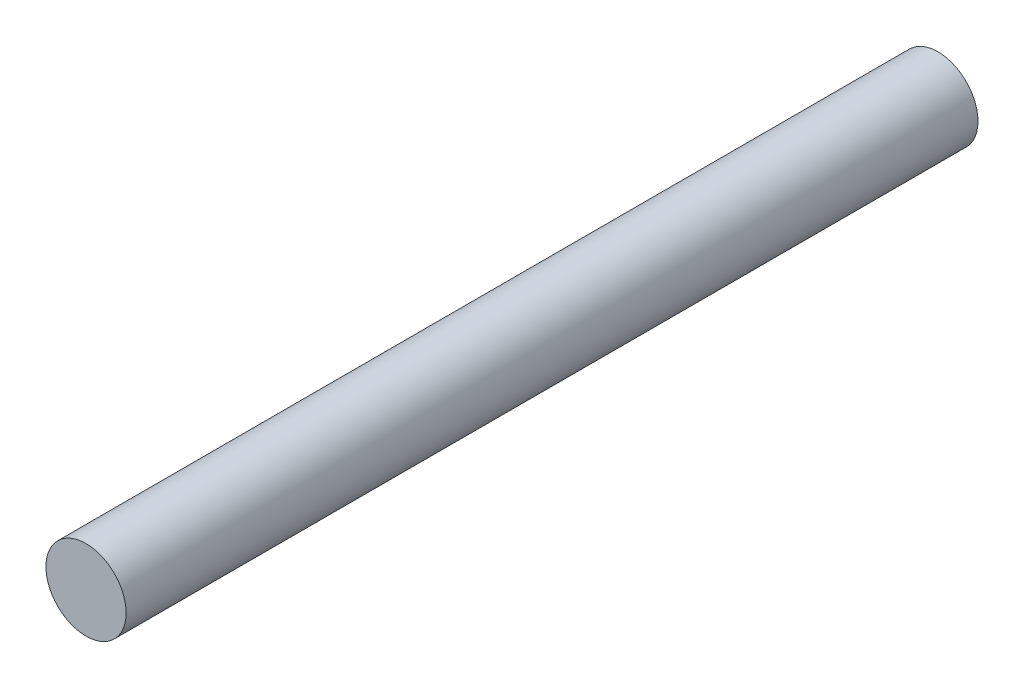
ISO-10303-21;
HEADER;
FILE_DESCRIPTION(('STEP AP214'),'2;1');
FILE_NAME('part.step','',(''),(''),'','','');
FILE_SCHEMA(('AUTOMOTIVE_DESIGN { 1 0 10303 214 1 1 1 1 }'));
ENDSEC;
DATA;
#1=APPLICATION_CONTEXT('core data for automotive mechanical design processes');
#2=APPLICATION_PROTOCOL_DEFINITION('international standard','automotive_design',2000,#1);
#3=PRODUCT_CONTEXT('',#1,'mechanical');
#4=PRODUCT('Part','Part','',(#3));
#5=PRODUCT_RELATED_PRODUCT_CATEGORY('part','',(#4));
#6=PRODUCT_DEFINITION_FORMATION('','',#4);
#7=PRODUCT_DEFINITION_CONTEXT('part definition',#1,'design');
#8=PRODUCT_DEFINITION('design','',#6,#7);
#9=PRODUCT_DEFINITION_SHAPE('','',#8);
#10=(LENGTH_UNIT() NAMED_UNIT(*) SI_UNIT(.MILLI.,.METRE.));
#11=(NAMED_UNIT(*) PLANE_ANGLE_UNIT() SI_UNIT($,.RADIAN.));
#12=(NAMED_UNIT(*) SI_UNIT($,.STERADIAN.) SOLID_ANGLE_UNIT());
#13=UNCERTAINTY_MEASURE_WITH_UNIT(LENGTH_MEASURE(1.E-05),#10,'distance_accuracy_value','');
#14=(GEOMETRIC_REPRESENTATION_CONTEXT(3) GLOBAL_UNCERTAINTY_ASSIGNED_CONTEXT((#13)) GLOBAL_UNIT_ASSIGNED_CONTEXT((#10,
#11,#12)) REPRESENTATION_CONTEXT('',''));
#15=CARTESIAN_POINT('',(0.,0.,0.));
#16=DIRECTION('',(0.,0.,1.));
#17=DIRECTION('',(1.,0.,0.));
#18=AXIS2_PLACEMENT_3D('',#15,#16,#17);
#19=CARTESIAN_POINT('',(0.,0.,170.));
#20=DIRECTION('',(0.,0.,-1.));
#21=DIRECTION('',(-1.,0.,0.));
#22=AXIS2_PLACEMENT_3D('',#19,#20,#21);
#23=CYLINDRICAL_SURFACE('',#22,8.);
#24=CARTESIAN_POINT('',(0.,0.,170.));
#25=DIRECTION('',(0.,0.,1.));
#26=DIRECTION('',(1.,0.,0.));
#27=AXIS2_PLACEMENT_3D('',#24,#25,#26);
#28=CIRCLE('',#27,8.);
#29=CARTESIAN_POINT('',(8.,0.,170.));
#30=VERTEX_POINT('',#29);
#31=EDGE_CURVE('E10',#30,#30,#28,.T.);
#32=ORIENTED_EDGE('',*,*,#31,.F.);
#33=EDGE_LOOP('',(#32));
#34=FACE_BOUND('',#33,.T.);
#35=CARTESIAN_POINT('',(0.,0.,0.));
#36=DIRECTION('',(0.,0.,1.));
#37=DIRECTION('',(1.,0.,0.));
#38=AXIS2_PLACEMENT_3D('',#35,#36,#37);
#39=CIRCLE('',#38,8.);
#40=CARTESIAN_POINT('',(8.,0.,0.));
#41=VERTEX_POINT('',#40);
#42=EDGE_CURVE('E34',#41,#41,#39,.T.);
#43=ORIENTED_EDGE('',*,*,#42,.T.);
#44=EDGE_LOOP('',(#43));
#45=FACE_BOUND('',#44,.T.);
#46=ADVANCED_FACE('F31',(#34,#45),#23,.T.);
#47=CARTESIAN_POINT('',(0.,0.,170.));
#48=DIRECTION('',(0.,0.,1.));
#49=DIRECTION('',(1.,0.,0.));
#50=AXIS2_PLACEMENT_3D('',#47,#48,#49);
#51=PLANE('',#50);
#52=ORIENTED_EDGE('',*,*,#31,.T.);
#53=EDGE_LOOP('',(#52));
#54=FACE_BOUND('',#53,.T.);
#55=ADVANCED_FACE('F46',(#54),#51,.T.);
#56=CARTESIAN_POINT('',(0.,0.,0.));
#57=DIRECTION('',(0.,0.,1.));
#58=DIRECTION('',(1.,0.,0.));
#59=AXIS2_PLACEMENT_3D('',#56,#57,#58);
#60=PLANE('',#59);
#61=ORIENTED_EDGE('',*,*,#42,.F.);
#62=EDGE_LOOP('',(#61));
#63=FACE_BOUND('',#62,.T.);
#64=ADVANCED_FACE('F44',(#63),#60,.F.);
#65=CLOSED_SHELL('',(#46,#55,#64));
#66=MANIFOLD_SOLID_BREP('B2',#65);
#67=ADVANCED_BREP_SHAPE_REPRESENTATION('',(#18,#66),#14);
#68=SHAPE_DEFINITION_REPRESENTATION(#9,#67);
ENDSEC;
END-ISO-10303-21;
